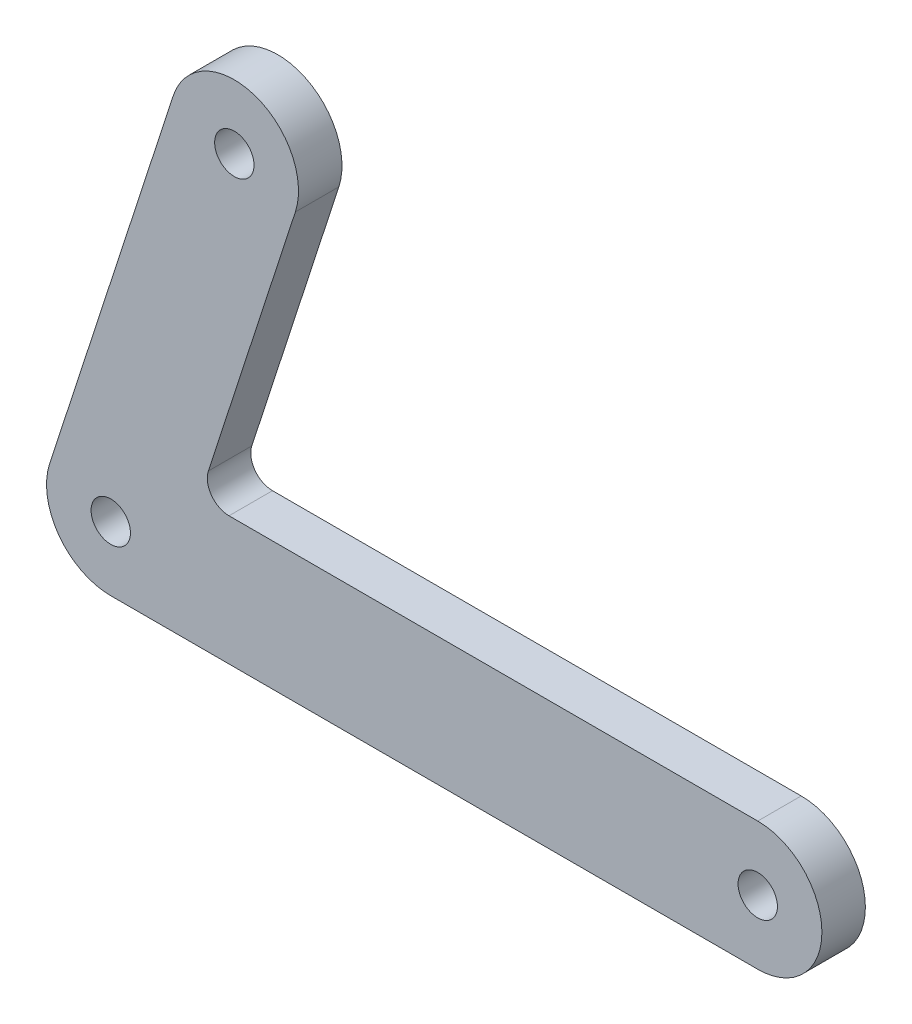
ISO-10303-21;
HEADER;
FILE_DESCRIPTION(('STEP AP214'),'2;1');
FILE_NAME('part.step','',(''),(''),'','','');
FILE_SCHEMA(('AUTOMOTIVE_DESIGN { 1 0 10303 214 1 1 1 1 }'));
ENDSEC;
DATA;
#1=APPLICATION_CONTEXT('core data for automotive mechanical design processes');
#2=APPLICATION_PROTOCOL_DEFINITION('international standard','automotive_design',2000,#1);
#3=PRODUCT_CONTEXT('',#1,'mechanical');
#4=PRODUCT('Part','Part','',(#3));
#5=PRODUCT_RELATED_PRODUCT_CATEGORY('part','',(#4));
#6=PRODUCT_DEFINITION_FORMATION('','',#4);
#7=PRODUCT_DEFINITION_CONTEXT('part definition',#1,'design');
#8=PRODUCT_DEFINITION('design','',#6,#7);
#9=PRODUCT_DEFINITION_SHAPE('','',#8);
#10=(LENGTH_UNIT() NAMED_UNIT(*) SI_UNIT(.MILLI.,.METRE.));
#11=(NAMED_UNIT(*) PLANE_ANGLE_UNIT() SI_UNIT($,.RADIAN.));
#12=(NAMED_UNIT(*) SI_UNIT($,.STERADIAN.) SOLID_ANGLE_UNIT());
#13=UNCERTAINTY_MEASURE_WITH_UNIT(LENGTH_MEASURE(1.E-05),#10,'distance_accuracy_value','');
#14=(GEOMETRIC_REPRESENTATION_CONTEXT(3) GLOBAL_UNCERTAINTY_ASSIGNED_CONTEXT((#13)) GLOBAL_UNIT_ASSIGNED_CONTEXT((#10,
#11,#12)) REPRESENTATION_CONTEXT('',''));
#15=CARTESIAN_POINT('',(0.,0.,0.));
#16=DIRECTION('',(0.,0.,1.));
#17=DIRECTION('',(1.,0.,0.));
#18=AXIS2_PLACEMENT_3D('',#15,#16,#17);
#19=CARTESIAN_POINT('',(0.,105.378842664636,5.08));
#20=DIRECTION('',(0.,-1.,0.));
#21=DIRECTION('',(0.,0.,-1.));
#22=AXIS2_PLACEMENT_3D('',#19,#20,#21);
#23=PLANE('',#22);
#24=DIRECTION('',(-1.,0.,0.));
#25=VECTOR('',#24,1.);
#26=CARTESIAN_POINT('',(0.,105.378842664636,0.));
#27=LINE('',#26,#25);
#28=CARTESIAN_POINT('',(133.58557917237,105.378842664636,0.));
#29=VERTEX_POINT('',#28);
#30=CARTESIAN_POINT('',(71.8044536539016,105.378842664636,0.));
#31=VERTEX_POINT('',#30);
#32=EDGE_CURVE('E155',#29,#31,#27,.T.);
#33=ORIENTED_EDGE('',*,*,#32,.T.);
#34=DIRECTION('',(0.,0.,-1.));
#35=VECTOR('',#34,1.);
#36=CARTESIAN_POINT('',(71.8044536539016,105.378842664636,5.08));
#37=LINE('',#36,#35);
#38=CARTESIAN_POINT('',(71.8044536539016,105.378842664636,5.08));
#39=VERTEX_POINT('',#38);
#40=EDGE_CURVE('E11',#39,#31,#37,.T.);
#41=ORIENTED_EDGE('',*,*,#40,.F.);
#42=DIRECTION('',(-1.,0.,0.));
#43=VECTOR('',#42,1.);
#44=CARTESIAN_POINT('',(0.,105.378842664636,5.08));
#45=LINE('',#44,#43);
#46=CARTESIAN_POINT('',(133.58557917237,105.378842664636,5.08));
#47=VERTEX_POINT('',#46);
#48=EDGE_CURVE('E219',#47,#39,#45,.T.);
#49=ORIENTED_EDGE('',*,*,#48,.F.);
#50=DIRECTION('',(0.,0.,-1.));
#51=VECTOR('',#50,1.);
#52=CARTESIAN_POINT('',(133.58557917237,105.378842664636,5.08));
#53=LINE('',#52,#51);
#54=EDGE_CURVE('E139',#47,#29,#53,.T.);
#55=ORIENTED_EDGE('',*,*,#54,.T.);
#56=EDGE_LOOP('',(#33,#41,#49,#55));
#57=FACE_BOUND('',#56,.T.);
#58=ADVANCED_FACE('F41',(#57),#23,.F.);
#59=CARTESIAN_POINT('',(71.8044536539016,107.918842664636,5.08));
#60=DIRECTION('',(0.,0.,-1.));
#61=DIRECTION('',(-1.,0.,0.));
#62=AXIS2_PLACEMENT_3D('',#59,#60,#61);
#63=CYLINDRICAL_SURFACE('',#62,2.54);
#64=CARTESIAN_POINT('',(71.8044536539016,107.918842664636,0.));
#65=DIRECTION('',(0.,0.,1.));
#66=DIRECTION('',(1.,0.,0.));
#67=AXIS2_PLACEMENT_3D('',#64,#65,#66);
#68=CIRCLE('',#67,2.54);
#69=CARTESIAN_POINT('',(69.3887701025119,108.703745830349,0.));
#70=VERTEX_POINT('',#69);
#71=EDGE_CURVE('E159',#31,#70,#68,.F.);
#72=ORIENTED_EDGE('',*,*,#71,.T.);
#73=DIRECTION('',(0.,0.,-1.));
#74=VECTOR('',#73,1.);
#75=CARTESIAN_POINT('',(69.3887701025119,108.703745830349,5.08));
#76=LINE('',#75,#74);
#77=CARTESIAN_POINT('',(69.3887701025119,108.703745830349,5.08));
#78=VERTEX_POINT('',#77);
#79=EDGE_CURVE('E51',#78,#70,#76,.T.);
#80=ORIENTED_EDGE('',*,*,#79,.F.);
#81=CARTESIAN_POINT('',(71.8044536539016,107.918842664636,5.08));
#82=DIRECTION('',(0.,0.,1.));
#83=DIRECTION('',(1.,0.,0.));
#84=AXIS2_PLACEMENT_3D('',#81,#82,#83);
#85=CIRCLE('',#84,2.54);
#86=EDGE_CURVE('E102',#39,#78,#85,.F.);
#87=ORIENTED_EDGE('',*,*,#86,.F.);
#88=ORIENTED_EDGE('',*,*,#40,.T.);
#89=EDGE_LOOP('',(#72,#80,#87,#88));
#90=FACE_BOUND('',#89,.T.);
#91=ADVANCED_FACE('F259',(#90),#63,.F.);
#92=CARTESIAN_POINT('',(30.8155028330955,-10.0125638197938,5.08));
#93=DIRECTION('',(-0.951056516295152,0.309016994374951,0.));
#94=DIRECTION('',(-0.309016994374951,-0.951056516295153,0.));
#95=AXIS2_PLACEMENT_3D('',#92,#93,#94);
#96=PLANE('',#95);
#97=DIRECTION('',(0.309016994374951,0.951056516295153,0.));
#98=VECTOR('',#97,1.);
#99=CARTESIAN_POINT('',(30.8155028330955,-10.0125638197938,0.));
#100=LINE('',#99,#98);
#101=CARTESIAN_POINT('',(79.5568182698389,139.997780280135,0.));
#102=VERTEX_POINT('',#101);
#103=EDGE_CURVE('E162',#70,#102,#100,.T.);
#104=ORIENTED_EDGE('',*,*,#103,.T.);
#105=DIRECTION('',(0.,0.,-1.));
#106=VECTOR('',#105,1.);
#107=CARTESIAN_POINT('',(79.5568182698389,139.997780280135,5.08));
#108=LINE('',#107,#106);
#109=CARTESIAN_POINT('',(79.5568182698389,139.997780280135,5.08));
#110=VERTEX_POINT('',#109);
#111=EDGE_CURVE('E188',#110,#102,#108,.T.);
#112=ORIENTED_EDGE('',*,*,#111,.F.);
#113=DIRECTION('',(0.309016994374951,0.951056516295153,0.));
#114=VECTOR('',#113,1.);
#115=CARTESIAN_POINT('',(30.8155028330955,-10.0125638197938,5.08));
#116=LINE('',#115,#114);
#117=EDGE_CURVE('E198',#78,#110,#116,.T.);
#118=ORIENTED_EDGE('',*,*,#117,.F.);
#119=ORIENTED_EDGE('',*,*,#79,.T.);
#120=EDGE_LOOP('',(#104,#112,#118,#119));
#121=FACE_BOUND('',#120,.T.);
#122=ADVANCED_FACE('F196',(#121),#96,.F.);
#123=CARTESIAN_POINT('',(72.4238943976253,142.315407737948,5.08));
#124=DIRECTION('',(0.,0.,-1.));
#125=DIRECTION('',(-1.,0.,0.));
#126=AXIS2_PLACEMENT_3D('',#123,#124,#125);
#127=CYLINDRICAL_SURFACE('',#126,7.5);
#128=CARTESIAN_POINT('',(72.4238943976253,142.315407737948,0.));
#129=DIRECTION('',(0.,0.,1.));
#130=DIRECTION('',(1.,0.,0.));
#131=AXIS2_PLACEMENT_3D('',#128,#129,#130);
#132=CIRCLE('',#131,7.5);
#133=CARTESIAN_POINT('',(65.2909705254117,144.63303519576,0.));
#134=VERTEX_POINT('',#133);
#135=EDGE_CURVE('E165',#102,#134,#132,.T.);
#136=ORIENTED_EDGE('',*,*,#135,.T.);
#137=DIRECTION('',(0.,0.,-1.));
#138=VECTOR('',#137,1.);
#139=CARTESIAN_POINT('',(65.2909705254117,144.63303519576,5.08));
#140=LINE('',#139,#138);
#141=CARTESIAN_POINT('',(65.2909705254117,144.63303519576,5.08));
#142=VERTEX_POINT('',#141);
#143=EDGE_CURVE('E184',#142,#134,#140,.T.);
#144=ORIENTED_EDGE('',*,*,#143,.F.);
#145=CARTESIAN_POINT('',(72.4238943976253,142.315407737948,5.08));
#146=DIRECTION('',(0.,0.,1.));
#147=DIRECTION('',(1.,0.,0.));
#148=AXIS2_PLACEMENT_3D('',#145,#146,#147);
#149=CIRCLE('',#148,7.5);
#150=EDGE_CURVE('E211',#110,#142,#149,.T.);
#151=ORIENTED_EDGE('',*,*,#150,.F.);
#152=ORIENTED_EDGE('',*,*,#111,.T.);
#153=EDGE_LOOP('',(#136,#144,#151,#152));
#154=FACE_BOUND('',#153,.T.);
#155=ADVANCED_FACE('F206',(#154),#127,.T.);
#156=CARTESIAN_POINT('',(16.5496550886682,-5.37730890416953,5.08));
#157=DIRECTION('',(0.951056516295152,-0.309016994374951,0.));
#158=DIRECTION('',(0.309016994374951,0.951056516295153,0.));
#159=AXIS2_PLACEMENT_3D('',#156,#157,#158);
#160=PLANE('',#159);
#161=DIRECTION('',(-0.309016994374951,-0.951056516295153,0.));
#162=VECTOR('',#161,1.);
#163=CARTESIAN_POINT('',(16.5496550886682,-5.37730890416953,0.));
#164=LINE('',#163,#162);
#165=CARTESIAN_POINT('',(50.8526553001575,100.196470122449,0.));
#166=VERTEX_POINT('',#165);
#167=EDGE_CURVE('E168',#134,#166,#164,.T.);
#168=ORIENTED_EDGE('',*,*,#167,.T.);
#169=DIRECTION('',(0.,0.,-1.));
#170=VECTOR('',#169,1.);
#171=CARTESIAN_POINT('',(50.8526553001575,100.196470122449,5.08));
#172=LINE('',#171,#170);
#173=CARTESIAN_POINT('',(50.8526553001575,100.196470122449,5.08));
#174=VERTEX_POINT('',#173);
#175=EDGE_CURVE('E132',#174,#166,#172,.T.);
#176=ORIENTED_EDGE('',*,*,#175,.F.);
#177=DIRECTION('',(-0.309016994374951,-0.951056516295153,0.));
#178=VECTOR('',#177,1.);
#179=CARTESIAN_POINT('',(16.5496550886682,-5.37730890416953,5.08));
#180=LINE('',#179,#178);
#181=EDGE_CURVE('E121',#142,#174,#180,.T.);
#182=ORIENTED_EDGE('',*,*,#181,.F.);
#183=ORIENTED_EDGE('',*,*,#143,.T.);
#184=EDGE_LOOP('',(#168,#176,#182,#183));
#185=FACE_BOUND('',#184,.T.);
#186=ADVANCED_FACE('F209',(#185),#160,.F.);
#187=CARTESIAN_POINT('',(57.9855791723702,97.8788426646361,5.08));
#188=DIRECTION('',(0.,0.,-1.));
#189=DIRECTION('',(-1.,0.,0.));
#190=AXIS2_PLACEMENT_3D('',#187,#188,#189);
#191=CYLINDRICAL_SURFACE('',#190,7.49999999999965);
#192=CARTESIAN_POINT('',(57.9855791723702,97.8788426646361,0.));
#193=DIRECTION('',(0.,0.,1.));
#194=DIRECTION('',(1.,0.,0.));
#195=AXIS2_PLACEMENT_3D('',#192,#193,#194);
#196=CIRCLE('',#195,7.49999999999965);
#197=CARTESIAN_POINT('',(57.9855791723702,90.3788426646361,0.));
#198=VERTEX_POINT('',#197);
#199=EDGE_CURVE('E130',#166,#198,#196,.T.);
#200=ORIENTED_EDGE('',*,*,#199,.T.);
#201=DIRECTION('',(0.,0.,-1.));
#202=VECTOR('',#201,1.);
#203=CARTESIAN_POINT('',(57.9855791723702,90.3788426646361,5.08));
#204=LINE('',#203,#202);
#205=CARTESIAN_POINT('',(57.9855791723702,90.3788426646361,5.08));
#206=VERTEX_POINT('',#205);
#207=EDGE_CURVE('E127',#206,#198,#204,.T.);
#208=ORIENTED_EDGE('',*,*,#207,.F.);
#209=CARTESIAN_POINT('',(57.9855791723702,97.8788426646361,5.08));
#210=DIRECTION('',(0.,0.,1.));
#211=DIRECTION('',(1.,0.,0.));
#212=AXIS2_PLACEMENT_3D('',#209,#210,#211);
#213=CIRCLE('',#212,7.49999999999965);
#214=EDGE_CURVE('E115',#174,#206,#213,.T.);
#215=ORIENTED_EDGE('',*,*,#214,.F.);
#216=ORIENTED_EDGE('',*,*,#175,.T.);
#217=EDGE_LOOP('',(#200,#208,#215,#216));
#218=FACE_BOUND('',#217,.T.);
#219=ADVANCED_FACE('F128',(#218),#191,.T.);
#220=CARTESIAN_POINT('',(0.,90.3788426646361,5.08));
#221=DIRECTION('',(0.,1.,0.));
#222=DIRECTION('',(0.,0.,1.));
#223=AXIS2_PLACEMENT_3D('',#220,#221,#222);
#224=PLANE('',#223);
#225=DIRECTION('',(1.,0.,0.));
#226=VECTOR('',#225,1.);
#227=CARTESIAN_POINT('',(0.,90.3788426646361,0.));
#228=LINE('',#227,#226);
#229=CARTESIAN_POINT('',(133.58557917237,90.3788426646361,0.));
#230=VERTEX_POINT('',#229);
#231=EDGE_CURVE('E88',#198,#230,#228,.T.);
#232=ORIENTED_EDGE('',*,*,#231,.T.);
#233=DIRECTION('',(0.,0.,-1.));
#234=VECTOR('',#233,1.);
#235=CARTESIAN_POINT('',(133.58557917237,90.3788426646361,5.08));
#236=LINE('',#235,#234);
#237=CARTESIAN_POINT('',(133.58557917237,90.3788426646361,5.08));
#238=VERTEX_POINT('',#237);
#239=EDGE_CURVE('E133',#238,#230,#236,.T.);
#240=ORIENTED_EDGE('',*,*,#239,.F.);
#241=DIRECTION('',(1.,0.,0.));
#242=VECTOR('',#241,1.);
#243=CARTESIAN_POINT('',(0.,90.3788426646361,5.08));
#244=LINE('',#243,#242);
#245=EDGE_CURVE('E119',#206,#238,#244,.T.);
#246=ORIENTED_EDGE('',*,*,#245,.F.);
#247=ORIENTED_EDGE('',*,*,#207,.T.);
#248=EDGE_LOOP('',(#232,#240,#246,#247));
#249=FACE_BOUND('',#248,.T.);
#250=ADVANCED_FACE('F135',(#249),#224,.F.);
#251=CARTESIAN_POINT('',(72.4238943976253,142.315407737948,5.08));
#252=DIRECTION('',(0.,0.,-1.));
#253=DIRECTION('',(-1.,0.,0.));
#254=AXIS2_PLACEMENT_3D('',#251,#252,#253);
#255=CYLINDRICAL_SURFACE('',#254,2.3);
#256=CARTESIAN_POINT('',(72.4238943976253,142.315407737948,5.08));
#257=DIRECTION('',(0.,0.,1.));
#258=DIRECTION('',(1.,0.,0.));
#259=AXIS2_PLACEMENT_3D('',#256,#257,#258);
#260=CIRCLE('',#259,2.3);
#261=CARTESIAN_POINT('',(74.7238943976253,142.315407737948,5.08));
#262=VERTEX_POINT('',#261);
#263=EDGE_CURVE('E222',#262,#262,#260,.T.);
#264=ORIENTED_EDGE('',*,*,#263,.T.);
#265=EDGE_LOOP('',(#264));
#266=FACE_BOUND('',#265,.T.);
#267=CARTESIAN_POINT('',(72.4238943976253,142.315407737948,0.));
#268=DIRECTION('',(0.,0.,1.));
#269=DIRECTION('',(1.,0.,0.));
#270=AXIS2_PLACEMENT_3D('',#267,#268,#269);
#271=CIRCLE('',#270,2.3);
#272=CARTESIAN_POINT('',(74.7238943976253,142.315407737948,0.));
#273=VERTEX_POINT('',#272);
#274=EDGE_CURVE('E151',#273,#273,#271,.T.);
#275=ORIENTED_EDGE('',*,*,#274,.F.);
#276=EDGE_LOOP('',(#275));
#277=FACE_BOUND('',#276,.T.);
#278=ADVANCED_FACE('F244',(#266,#277),#255,.F.);
#279=CARTESIAN_POINT('',(133.58557917237,97.8788426646361,5.08));
#280=DIRECTION('',(0.,0.,-1.));
#281=DIRECTION('',(-1.,0.,0.));
#282=AXIS2_PLACEMENT_3D('',#279,#280,#281);
#283=CYLINDRICAL_SURFACE('',#282,2.30000000000001);
#284=CARTESIAN_POINT('',(133.58557917237,97.8788426646361,5.08));
#285=DIRECTION('',(0.,0.,1.));
#286=DIRECTION('',(1.,0.,0.));
#287=AXIS2_PLACEMENT_3D('',#284,#285,#286);
#288=CIRCLE('',#287,2.30000000000001);
#289=CARTESIAN_POINT('',(135.88557917237,97.8788426646361,5.08));
#290=VERTEX_POINT('',#289);
#291=EDGE_CURVE('E226',#290,#290,#288,.T.);
#292=ORIENTED_EDGE('',*,*,#291,.T.);
#293=EDGE_LOOP('',(#292));
#294=FACE_BOUND('',#293,.T.);
#295=CARTESIAN_POINT('',(133.58557917237,97.8788426646361,0.));
#296=DIRECTION('',(0.,0.,1.));
#297=DIRECTION('',(1.,0.,0.));
#298=AXIS2_PLACEMENT_3D('',#295,#296,#297);
#299=CIRCLE('',#298,2.30000000000001);
#300=CARTESIAN_POINT('',(135.88557917237,97.8788426646361,0.));
#301=VERTEX_POINT('',#300);
#302=EDGE_CURVE('E147',#301,#301,#299,.T.);
#303=ORIENTED_EDGE('',*,*,#302,.F.);
#304=EDGE_LOOP('',(#303));
#305=FACE_BOUND('',#304,.T.);
#306=ADVANCED_FACE('F247',(#294,#305),#283,.F.);
#307=CARTESIAN_POINT('',(57.9855791723702,97.8788426646361,5.08));
#308=DIRECTION('',(0.,0.,-1.));
#309=DIRECTION('',(-1.,0.,0.));
#310=AXIS2_PLACEMENT_3D('',#307,#308,#309);
#311=CYLINDRICAL_SURFACE('',#310,2.3);
#312=CARTESIAN_POINT('',(57.9855791723702,97.8788426646361,5.08));
#313=DIRECTION('',(0.,0.,1.));
#314=DIRECTION('',(1.,0.,0.));
#315=AXIS2_PLACEMENT_3D('',#312,#313,#314);
#316=CIRCLE('',#315,2.3);
#317=CARTESIAN_POINT('',(60.2855791723702,97.8788426646361,5.08));
#318=VERTEX_POINT('',#317);
#319=EDGE_CURVE('E177',#318,#318,#316,.T.);
#320=ORIENTED_EDGE('',*,*,#319,.T.);
#321=EDGE_LOOP('',(#320));
#322=FACE_BOUND('',#321,.T.);
#323=CARTESIAN_POINT('',(57.9855791723702,97.8788426646361,0.));
#324=DIRECTION('',(0.,0.,1.));
#325=DIRECTION('',(1.,0.,0.));
#326=AXIS2_PLACEMENT_3D('',#323,#324,#325);
#327=CIRCLE('',#326,2.3);
#328=CARTESIAN_POINT('',(60.2855791723702,97.8788426646361,0.));
#329=VERTEX_POINT('',#328);
#330=EDGE_CURVE('E143',#329,#329,#327,.T.);
#331=ORIENTED_EDGE('',*,*,#330,.F.);
#332=EDGE_LOOP('',(#331));
#333=FACE_BOUND('',#332,.T.);
#334=ADVANCED_FACE('F43',(#322,#333),#311,.F.);
#335=CARTESIAN_POINT('',(133.58557917237,97.8788426646361,5.08));
#336=DIRECTION('',(0.,0.,-1.));
#337=DIRECTION('',(-1.,0.,0.));
#338=AXIS2_PLACEMENT_3D('',#335,#336,#337);
#339=CYLINDRICAL_SURFACE('',#338,7.49999999999999);
#340=CARTESIAN_POINT('',(133.58557917237,97.8788426646361,0.));
#341=DIRECTION('',(0.,0.,1.));
#342=DIRECTION('',(1.,0.,0.));
#343=AXIS2_PLACEMENT_3D('',#340,#341,#342);
#344=CIRCLE('',#343,7.49999999999999);
#345=EDGE_CURVE('E94',#230,#29,#344,.T.);
#346=ORIENTED_EDGE('',*,*,#345,.T.);
#347=ORIENTED_EDGE('',*,*,#54,.F.);
#348=CARTESIAN_POINT('',(133.58557917237,97.8788426646361,5.08));
#349=DIRECTION('',(0.,0.,1.));
#350=DIRECTION('',(1.,0.,0.));
#351=AXIS2_PLACEMENT_3D('',#348,#349,#350);
#352=CIRCLE('',#351,7.49999999999999);
#353=EDGE_CURVE('E59',#238,#47,#352,.T.);
#354=ORIENTED_EDGE('',*,*,#353,.F.);
#355=ORIENTED_EDGE('',*,*,#239,.T.);
#356=EDGE_LOOP('',(#346,#347,#354,#355));
#357=FACE_BOUND('',#356,.T.);
#358=ADVANCED_FACE('F238',(#357),#339,.T.);
#359=CARTESIAN_POINT('',(0.,0.,5.08));
#360=DIRECTION('',(0.,0.,1.));
#361=DIRECTION('',(1.,0.,0.));
#362=AXIS2_PLACEMENT_3D('',#359,#360,#361);
#363=PLANE('',#362);
#364=ORIENTED_EDGE('',*,*,#319,.F.);
#365=EDGE_LOOP('',(#364));
#366=FACE_BOUND('',#365,.T.);
#367=ORIENTED_EDGE('',*,*,#291,.F.);
#368=EDGE_LOOP('',(#367));
#369=FACE_BOUND('',#368,.T.);
#370=ORIENTED_EDGE('',*,*,#263,.F.);
#371=EDGE_LOOP('',(#370));
#372=FACE_BOUND('',#371,.T.);
#373=ORIENTED_EDGE('',*,*,#48,.T.);
#374=ORIENTED_EDGE('',*,*,#86,.T.);
#375=ORIENTED_EDGE('',*,*,#117,.T.);
#376=ORIENTED_EDGE('',*,*,#150,.T.);
#377=ORIENTED_EDGE('',*,*,#181,.T.);
#378=ORIENTED_EDGE('',*,*,#214,.T.);
#379=ORIENTED_EDGE('',*,*,#245,.T.);
#380=ORIENTED_EDGE('',*,*,#353,.T.);
#381=EDGE_LOOP('',(#373,#374,#375,#376,#377,#378,#379,#380));
#382=FACE_BOUND('',#381,.T.);
#383=ADVANCED_FACE('F117',(#366,#369,#372,#382),#363,.T.);
#384=CARTESIAN_POINT('',(0.,0.,0.));
#385=DIRECTION('',(0.,0.,1.));
#386=DIRECTION('',(1.,0.,0.));
#387=AXIS2_PLACEMENT_3D('',#384,#385,#386);
#388=PLANE('',#387);
#389=ORIENTED_EDGE('',*,*,#330,.T.);
#390=EDGE_LOOP('',(#389));
#391=FACE_BOUND('',#390,.T.);
#392=ORIENTED_EDGE('',*,*,#302,.T.);
#393=EDGE_LOOP('',(#392));
#394=FACE_BOUND('',#393,.T.);
#395=ORIENTED_EDGE('',*,*,#274,.T.);
#396=EDGE_LOOP('',(#395));
#397=FACE_BOUND('',#396,.T.);
#398=ORIENTED_EDGE('',*,*,#32,.F.);
#399=ORIENTED_EDGE('',*,*,#345,.F.);
#400=ORIENTED_EDGE('',*,*,#231,.F.);
#401=ORIENTED_EDGE('',*,*,#199,.F.);
#402=ORIENTED_EDGE('',*,*,#167,.F.);
#403=ORIENTED_EDGE('',*,*,#135,.F.);
#404=ORIENTED_EDGE('',*,*,#103,.F.);
#405=ORIENTED_EDGE('',*,*,#71,.F.);
#406=EDGE_LOOP('',(#398,#399,#400,#401,#402,#403,#404,#405));
#407=FACE_BOUND('',#406,.T.);
#408=ADVANCED_FACE('F202',(#391,#394,#397,#407),#388,.F.);
#409=CLOSED_SHELL('',(#58,#91,#122,#155,#186,#219,#250,#278,#306,#334,#358,#383,#408));
#410=MANIFOLD_SOLID_BREP('B2',#409);
#411=ADVANCED_BREP_SHAPE_REPRESENTATION('',(#18,#410),#14);
#412=SHAPE_DEFINITION_REPRESENTATION(#9,#411);
ENDSEC;
END-ISO-10303-21;
